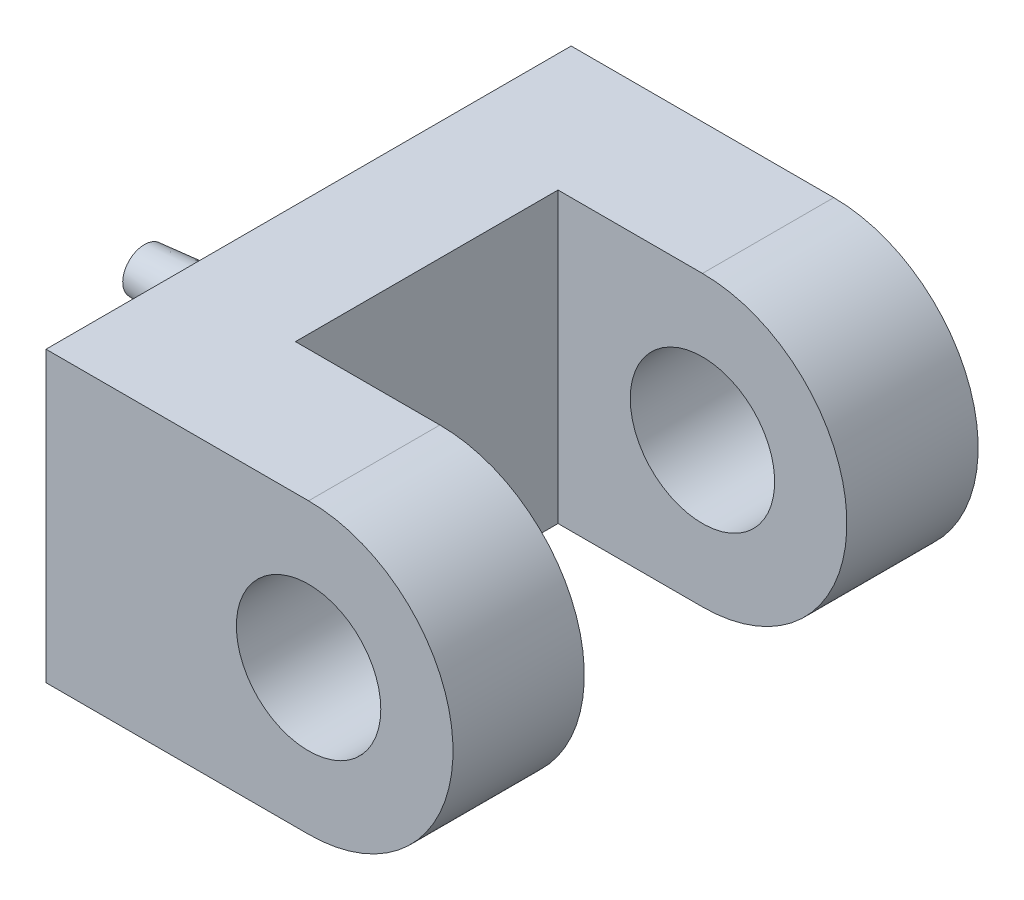
ISO-10303-21;
HEADER;
FILE_DESCRIPTION(('STEP AP214'),'2;1');
FILE_NAME('part.step','',(''),(''),'','','');
FILE_SCHEMA(('AUTOMOTIVE_DESIGN { 1 0 10303 214 1 1 1 1 }'));
ENDSEC;
DATA;
#1=APPLICATION_CONTEXT('core data for automotive mechanical design processes');
#2=APPLICATION_PROTOCOL_DEFINITION('international standard','automotive_design',2000,#1);
#3=PRODUCT_CONTEXT('',#1,'mechanical');
#4=PRODUCT('Part','Part','',(#3));
#5=PRODUCT_RELATED_PRODUCT_CATEGORY('part','',(#4));
#6=PRODUCT_DEFINITION_FORMATION('','',#4);
#7=PRODUCT_DEFINITION_CONTEXT('part definition',#1,'design');
#8=PRODUCT_DEFINITION('design','',#6,#7);
#9=PRODUCT_DEFINITION_SHAPE('','',#8);
#10=(LENGTH_UNIT() NAMED_UNIT(*) SI_UNIT(.MILLI.,.METRE.));
#11=(NAMED_UNIT(*) PLANE_ANGLE_UNIT() SI_UNIT($,.RADIAN.));
#12=(NAMED_UNIT(*) SI_UNIT($,.STERADIAN.) SOLID_ANGLE_UNIT());
#13=UNCERTAINTY_MEASURE_WITH_UNIT(LENGTH_MEASURE(1.E-05),#10,'distance_accuracy_value','');
#14=(GEOMETRIC_REPRESENTATION_CONTEXT(3) GLOBAL_UNCERTAINTY_ASSIGNED_CONTEXT((#13)) GLOBAL_UNIT_ASSIGNED_CONTEXT((#10,
#11,#12)) REPRESENTATION_CONTEXT('',''));
#15=CARTESIAN_POINT('',(0.,0.,0.));
#16=DIRECTION('',(0.,0.,1.));
#17=DIRECTION('',(1.,0.,0.));
#18=AXIS2_PLACEMENT_3D('',#15,#16,#17);
#19=CARTESIAN_POINT('',(0.,0.,40.));
#20=DIRECTION('',(0.,0.,-1.));
#21=DIRECTION('',(-1.,0.,0.));
#22=AXIS2_PLACEMENT_3D('',#19,#20,#21);
#23=CYLINDRICAL_SURFACE('',#22,22.);
#24=CARTESIAN_POINT('',(0.,0.,20.));
#25=DIRECTION('',(0.,0.,1.));
#26=DIRECTION('',(1.,0.,0.));
#27=AXIS2_PLACEMENT_3D('',#24,#25,#26);
#28=CIRCLE('',#27,22.);
#29=CARTESIAN_POINT('',(0.,-22.,20.));
#30=VERTEX_POINT('',#29);
#31=CARTESIAN_POINT('',(0.,22.,20.));
#32=VERTEX_POINT('',#31);
#33=EDGE_CURVE('E141',#30,#32,#28,.T.);
#34=ORIENTED_EDGE('',*,*,#33,.T.);
#35=DIRECTION('',(0.,0.,-1.));
#36=VECTOR('',#35,1.);
#37=CARTESIAN_POINT('',(0.,22.,40.));
#38=LINE('',#37,#36);
#39=CARTESIAN_POINT('',(0.,22.,40.));
#40=VERTEX_POINT('',#39);
#41=EDGE_CURVE('E41',#40,#32,#38,.T.);
#42=ORIENTED_EDGE('',*,*,#41,.F.);
#43=CARTESIAN_POINT('',(0.,0.,40.));
#44=DIRECTION('',(0.,0.,1.));
#45=DIRECTION('',(-1.,0.,0.));
#46=AXIS2_PLACEMENT_3D('',#43,#44,#45);
#47=CIRCLE('',#46,22.);
#48=CARTESIAN_POINT('',(0.,-22.,40.));
#49=VERTEX_POINT('',#48);
#50=EDGE_CURVE('E150',#49,#40,#47,.T.);
#51=ORIENTED_EDGE('',*,*,#50,.F.);
#52=DIRECTION('',(0.,0.,-1.));
#53=VECTOR('',#52,1.);
#54=CARTESIAN_POINT('',(0.,-22.,40.));
#55=LINE('',#54,#53);
#56=EDGE_CURVE('E163',#49,#30,#55,.T.);
#57=ORIENTED_EDGE('',*,*,#56,.T.);
#58=EDGE_LOOP('',(#34,#42,#51,#57));
#59=FACE_BOUND('',#58,.T.);
#60=ADVANCED_FACE('F33',(#59),#23,.T.);
#61=CARTESIAN_POINT('',(0.,0.,40.));
#62=DIRECTION('',(0.,0.,-1.));
#63=DIRECTION('',(-1.,0.,0.));
#64=AXIS2_PLACEMENT_3D('',#61,#62,#63);
#65=CYLINDRICAL_SURFACE('',#64,11.);
#66=CARTESIAN_POINT('',(0.,0.,20.));
#67=DIRECTION('',(0.,0.,1.));
#68=DIRECTION('',(1.,0.,0.));
#69=AXIS2_PLACEMENT_3D('',#66,#67,#68);
#70=CIRCLE('',#69,11.);
#71=CARTESIAN_POINT('',(11.,0.,20.));
#72=VERTEX_POINT('',#71);
#73=EDGE_CURVE('E140',#72,#72,#70,.T.);
#74=ORIENTED_EDGE('',*,*,#73,.F.);
#75=EDGE_LOOP('',(#74));
#76=FACE_BOUND('',#75,.T.);
#77=CARTESIAN_POINT('',(0.,0.,40.));
#78=DIRECTION('',(0.,0.,1.));
#79=DIRECTION('',(1.,0.,0.));
#80=AXIS2_PLACEMENT_3D('',#77,#78,#79);
#81=CIRCLE('',#80,11.);
#82=CARTESIAN_POINT('',(11.,0.,40.));
#83=VERTEX_POINT('',#82);
#84=EDGE_CURVE('E144',#83,#83,#81,.T.);
#85=ORIENTED_EDGE('',*,*,#84,.T.);
#86=EDGE_LOOP('',(#85));
#87=FACE_BOUND('',#86,.T.);
#88=ADVANCED_FACE('F181',(#76,#87),#65,.F.);
#89=CARTESIAN_POINT('',(0.,0.,40.));
#90=DIRECTION('',(0.,0.,-1.));
#91=DIRECTION('',(-1.,0.,0.));
#92=AXIS2_PLACEMENT_3D('',#89,#90,#91);
#93=PLANE('',#92);
#94=ORIENTED_EDGE('',*,*,#50,.T.);
#95=DIRECTION('',(-1.,0.,0.));
#96=VECTOR('',#95,1.);
#97=CARTESIAN_POINT('',(0.,22.,40.));
#98=LINE('',#97,#96);
#99=CARTESIAN_POINT('',(-40.,22.,40.));
#100=VERTEX_POINT('',#99);
#101=EDGE_CURVE('E87',#40,#100,#98,.T.);
#102=ORIENTED_EDGE('',*,*,#101,.T.);
#103=DIRECTION('',(0.,-1.,0.));
#104=VECTOR('',#103,1.);
#105=CARTESIAN_POINT('',(-40.,22.,40.));
#106=LINE('',#105,#104);
#107=CARTESIAN_POINT('',(-40.,-22.,40.));
#108=VERTEX_POINT('',#107);
#109=EDGE_CURVE('E154',#100,#108,#106,.T.);
#110=ORIENTED_EDGE('',*,*,#109,.T.);
#111=DIRECTION('',(1.,0.,0.));
#112=VECTOR('',#111,1.);
#113=CARTESIAN_POINT('',(-40.,-22.,40.));
#114=LINE('',#113,#112);
#115=EDGE_CURVE('E57',#108,#49,#114,.T.);
#116=ORIENTED_EDGE('',*,*,#115,.T.);
#117=EDGE_LOOP('',(#94,#102,#110,#116));
#118=FACE_BOUND('',#117,.T.);
#119=ORIENTED_EDGE('',*,*,#84,.F.);
#120=EDGE_LOOP('',(#119));
#121=FACE_BOUND('',#120,.T.);
#122=ADVANCED_FACE('F184',(#118,#121),#93,.F.);
#123=CARTESIAN_POINT('',(0.,0.,-40.));
#124=DIRECTION('',(0.,0.,-1.));
#125=DIRECTION('',(-1.,0.,0.));
#126=AXIS2_PLACEMENT_3D('',#123,#124,#125);
#127=PLANE('',#126);
#128=CARTESIAN_POINT('',(0.,0.,-40.));
#129=DIRECTION('',(0.,0.,1.));
#130=DIRECTION('',(-1.,0.,0.));
#131=AXIS2_PLACEMENT_3D('',#128,#129,#130);
#132=CIRCLE('',#131,22.);
#133=CARTESIAN_POINT('',(0.,-22.,-40.));
#134=VERTEX_POINT('',#133);
#135=CARTESIAN_POINT('',(0.,22.,-40.));
#136=VERTEX_POINT('',#135);
#137=EDGE_CURVE('E147',#134,#136,#132,.T.);
#138=ORIENTED_EDGE('',*,*,#137,.F.);
#139=DIRECTION('',(1.,0.,0.));
#140=VECTOR('',#139,1.);
#141=CARTESIAN_POINT('',(-40.,-22.,-40.));
#142=LINE('',#141,#140);
#143=CARTESIAN_POINT('',(-40.,-22.,-40.));
#144=VERTEX_POINT('',#143);
#145=EDGE_CURVE('E152',#144,#134,#142,.T.);
#146=ORIENTED_EDGE('',*,*,#145,.F.);
#147=DIRECTION('',(0.,-1.,0.));
#148=VECTOR('',#147,1.);
#149=CARTESIAN_POINT('',(-40.,22.,-40.));
#150=LINE('',#149,#148);
#151=CARTESIAN_POINT('',(-40.,22.,-40.));
#152=VERTEX_POINT('',#151);
#153=EDGE_CURVE('E160',#152,#144,#150,.T.);
#154=ORIENTED_EDGE('',*,*,#153,.F.);
#155=DIRECTION('',(-1.,0.,0.));
#156=VECTOR('',#155,1.);
#157=CARTESIAN_POINT('',(0.,22.,-40.));
#158=LINE('',#157,#156);
#159=EDGE_CURVE('E158',#136,#152,#158,.T.);
#160=ORIENTED_EDGE('',*,*,#159,.F.);
#161=EDGE_LOOP('',(#138,#146,#154,#160));
#162=FACE_BOUND('',#161,.T.);
#163=CARTESIAN_POINT('',(0.,0.,-40.));
#164=DIRECTION('',(0.,0.,1.));
#165=DIRECTION('',(1.,0.,0.));
#166=AXIS2_PLACEMENT_3D('',#163,#164,#165);
#167=CIRCLE('',#166,11.);
#168=CARTESIAN_POINT('',(11.,0.,-40.));
#169=VERTEX_POINT('',#168);
#170=EDGE_CURVE('E143',#169,#169,#167,.T.);
#171=ORIENTED_EDGE('',*,*,#170,.T.);
#172=EDGE_LOOP('',(#171));
#173=FACE_BOUND('',#172,.T.);
#174=ADVANCED_FACE('F190',(#162,#173),#127,.T.);
#175=CARTESIAN_POINT('',(0.,22.,-20.));
#176=VERTEX_POINT('',#175);
#177=EDGE_CURVE('E172',#176,#136,#38,.T.);
#178=ORIENTED_EDGE('',*,*,#177,.F.);
#179=CARTESIAN_POINT('',(0.,0.,-20.));
#180=DIRECTION('',(0.,0.,-1.));
#181=DIRECTION('',(-1.,0.,0.));
#182=AXIS2_PLACEMENT_3D('',#179,#180,#181);
#183=CIRCLE('',#182,22.);
#184=CARTESIAN_POINT('',(0.,-22.,-20.));
#185=VERTEX_POINT('',#184);
#186=EDGE_CURVE('E113',#176,#185,#183,.T.);
#187=ORIENTED_EDGE('',*,*,#186,.T.);
#188=EDGE_CURVE('E79',#185,#134,#55,.T.);
#189=ORIENTED_EDGE('',*,*,#188,.T.);
#190=ORIENTED_EDGE('',*,*,#137,.T.);
#191=EDGE_LOOP('',(#178,#187,#189,#190));
#192=FACE_BOUND('',#191,.T.);
#193=ADVANCED_FACE('F35',(#192),#23,.T.);
#194=CARTESIAN_POINT('',(0.,22.,40.));
#195=DIRECTION('',(0.,-1.,0.));
#196=DIRECTION('',(1.,0.,0.));
#197=AXIS2_PLACEMENT_3D('',#194,#195,#196);
#198=PLANE('',#197);
#199=ORIENTED_EDGE('',*,*,#41,.T.);
#200=DIRECTION('',(1.,0.,0.));
#201=VECTOR('',#200,1.);
#202=CARTESIAN_POINT('',(-22.,22.,20.));
#203=LINE('',#202,#201);
#204=CARTESIAN_POINT('',(-22.,22.,20.));
#205=VERTEX_POINT('',#204);
#206=EDGE_CURVE('E127',#205,#32,#203,.T.);
#207=ORIENTED_EDGE('',*,*,#206,.F.);
#208=DIRECTION('',(0.,0.,1.));
#209=VECTOR('',#208,1.);
#210=CARTESIAN_POINT('',(-22.,22.,20.));
#211=LINE('',#210,#209);
#212=CARTESIAN_POINT('',(-22.,22.,-20.));
#213=VERTEX_POINT('',#212);
#214=EDGE_CURVE('E116',#213,#205,#211,.T.);
#215=ORIENTED_EDGE('',*,*,#214,.F.);
#216=DIRECTION('',(-1.,0.,0.));
#217=VECTOR('',#216,1.);
#218=CARTESIAN_POINT('',(-22.,22.,-20.));
#219=LINE('',#218,#217);
#220=EDGE_CURVE('E108',#176,#213,#219,.T.);
#221=ORIENTED_EDGE('',*,*,#220,.F.);
#222=ORIENTED_EDGE('',*,*,#177,.T.);
#223=ORIENTED_EDGE('',*,*,#159,.T.);
#224=DIRECTION('',(0.,0.,-1.));
#225=VECTOR('',#224,1.);
#226=CARTESIAN_POINT('',(-40.,22.,40.));
#227=LINE('',#226,#225);
#228=EDGE_CURVE('E169',#100,#152,#227,.T.);
#229=ORIENTED_EDGE('',*,*,#228,.F.);
#230=ORIENTED_EDGE('',*,*,#101,.F.);
#231=EDGE_LOOP('',(#199,#207,#215,#221,#222,#223,#229,#230));
#232=FACE_BOUND('',#231,.T.);
#233=ADVANCED_FACE('F125',(#232),#198,.F.);
#234=CARTESIAN_POINT('',(-40.,22.,40.));
#235=DIRECTION('',(1.,0.,0.));
#236=DIRECTION('',(0.,1.,0.));
#237=AXIS2_PLACEMENT_3D('',#234,#235,#236);
#238=PLANE('',#237);
#239=CARTESIAN_POINT('',(-40.,0.,0.));
#240=DIRECTION('',(1.,0.,0.));
#241=DIRECTION('',(0.,1.,0.));
#242=AXIS2_PLACEMENT_3D('',#239,#240,#241);
#243=CIRCLE('',#242,5.5);
#244=CARTESIAN_POINT('',(-40.,5.49999999999999,0.));
#245=VERTEX_POINT('',#244);
#246=EDGE_CURVE('E11',#245,#245,#243,.F.);
#247=ORIENTED_EDGE('',*,*,#246,.F.);
#248=EDGE_LOOP('',(#247));
#249=FACE_BOUND('',#248,.T.);
#250=ORIENTED_EDGE('',*,*,#153,.T.);
#251=DIRECTION('',(0.,0.,-1.));
#252=VECTOR('',#251,1.);
#253=CARTESIAN_POINT('',(-40.,-22.,40.));
#254=LINE('',#253,#252);
#255=EDGE_CURVE('E166',#108,#144,#254,.T.);
#256=ORIENTED_EDGE('',*,*,#255,.F.);
#257=ORIENTED_EDGE('',*,*,#109,.F.);
#258=ORIENTED_EDGE('',*,*,#228,.T.);
#259=EDGE_LOOP('',(#250,#256,#257,#258));
#260=FACE_BOUND('',#259,.T.);
#261=ADVANCED_FACE('F205',(#249,#260),#238,.F.);
#262=CARTESIAN_POINT('',(-40.,-22.,40.));
#263=DIRECTION('',(0.,1.,0.));
#264=DIRECTION('',(0.,0.,1.));
#265=AXIS2_PLACEMENT_3D('',#262,#263,#264);
#266=PLANE('',#265);
#267=DIRECTION('',(0.,0.,1.));
#268=VECTOR('',#267,1.);
#269=CARTESIAN_POINT('',(-22.,-22.,20.));
#270=LINE('',#269,#268);
#271=CARTESIAN_POINT('',(-22.,-22.,-20.));
#272=VERTEX_POINT('',#271);
#273=CARTESIAN_POINT('',(-22.,-22.,20.));
#274=VERTEX_POINT('',#273);
#275=EDGE_CURVE('E48',#272,#274,#270,.T.);
#276=ORIENTED_EDGE('',*,*,#275,.T.);
#277=DIRECTION('',(1.,0.,0.));
#278=VECTOR('',#277,1.);
#279=CARTESIAN_POINT('',(-22.,-22.,20.));
#280=LINE('',#279,#278);
#281=EDGE_CURVE('E123',#274,#30,#280,.T.);
#282=ORIENTED_EDGE('',*,*,#281,.T.);
#283=ORIENTED_EDGE('',*,*,#56,.F.);
#284=ORIENTED_EDGE('',*,*,#115,.F.);
#285=ORIENTED_EDGE('',*,*,#255,.T.);
#286=ORIENTED_EDGE('',*,*,#145,.T.);
#287=ORIENTED_EDGE('',*,*,#188,.F.);
#288=DIRECTION('',(-1.,0.,0.));
#289=VECTOR('',#288,1.);
#290=CARTESIAN_POINT('',(-22.,-22.,-20.));
#291=LINE('',#290,#289);
#292=EDGE_CURVE('E129',#185,#272,#291,.T.);
#293=ORIENTED_EDGE('',*,*,#292,.T.);
#294=EDGE_LOOP('',(#276,#282,#283,#284,#285,#286,#287,#293));
#295=FACE_BOUND('',#294,.T.);
#296=ADVANCED_FACE('F215',(#295),#266,.F.);
#297=CARTESIAN_POINT('',(0.,0.,-20.));
#298=DIRECTION('',(0.,0.,-1.));
#299=DIRECTION('',(-1.,0.,0.));
#300=AXIS2_PLACEMENT_3D('',#297,#298,#299);
#301=CIRCLE('',#300,11.);
#302=CARTESIAN_POINT('',(-11.,0.,-20.));
#303=VERTEX_POINT('',#302);
#304=EDGE_CURVE('E137',#303,#303,#301,.T.);
#305=ORIENTED_EDGE('',*,*,#304,.F.);
#306=EDGE_LOOP('',(#305));
#307=FACE_BOUND('',#306,.T.);
#308=ORIENTED_EDGE('',*,*,#170,.F.);
#309=EDGE_LOOP('',(#308));
#310=FACE_BOUND('',#309,.T.);
#311=ADVANCED_FACE('F186',(#307,#310),#65,.F.);
#312=CARTESIAN_POINT('',(-22.,-22.,20.));
#313=DIRECTION('',(0.,0.,1.));
#314=DIRECTION('',(1.,0.,0.));
#315=AXIS2_PLACEMENT_3D('',#312,#313,#314);
#316=PLANE('',#315);
#317=ORIENTED_EDGE('',*,*,#73,.T.);
#318=EDGE_LOOP('',(#317));
#319=FACE_BOUND('',#318,.T.);
#320=ORIENTED_EDGE('',*,*,#33,.F.);
#321=ORIENTED_EDGE('',*,*,#281,.F.);
#322=DIRECTION('',(0.,1.,0.));
#323=VECTOR('',#322,1.);
#324=CARTESIAN_POINT('',(-22.,-22.,20.));
#325=LINE('',#324,#323);
#326=EDGE_CURVE('E122',#274,#205,#325,.T.);
#327=ORIENTED_EDGE('',*,*,#326,.T.);
#328=ORIENTED_EDGE('',*,*,#206,.T.);
#329=EDGE_LOOP('',(#320,#321,#327,#328));
#330=FACE_BOUND('',#329,.T.);
#331=ADVANCED_FACE('F178',(#319,#330),#316,.F.);
#332=CARTESIAN_POINT('',(-22.,-22.,-20.));
#333=DIRECTION('',(0.,0.,-1.));
#334=DIRECTION('',(-1.,0.,0.));
#335=AXIS2_PLACEMENT_3D('',#332,#333,#334);
#336=PLANE('',#335);
#337=ORIENTED_EDGE('',*,*,#304,.T.);
#338=EDGE_LOOP('',(#337));
#339=FACE_BOUND('',#338,.T.);
#340=ORIENTED_EDGE('',*,*,#220,.T.);
#341=DIRECTION('',(0.,1.,0.));
#342=VECTOR('',#341,1.);
#343=CARTESIAN_POINT('',(-22.,-22.,-20.));
#344=LINE('',#343,#342);
#345=EDGE_CURVE('E111',#272,#213,#344,.T.);
#346=ORIENTED_EDGE('',*,*,#345,.F.);
#347=ORIENTED_EDGE('',*,*,#292,.F.);
#348=ORIENTED_EDGE('',*,*,#186,.F.);
#349=EDGE_LOOP('',(#340,#346,#347,#348));
#350=FACE_BOUND('',#349,.T.);
#351=ADVANCED_FACE('F109',(#339,#350),#336,.F.);
#352=CARTESIAN_POINT('',(-22.,-22.,20.));
#353=DIRECTION('',(-1.,0.,0.));
#354=DIRECTION('',(0.,0.,1.));
#355=AXIS2_PLACEMENT_3D('',#352,#353,#354);
#356=PLANE('',#355);
#357=ORIENTED_EDGE('',*,*,#326,.F.);
#358=ORIENTED_EDGE('',*,*,#275,.F.);
#359=ORIENTED_EDGE('',*,*,#345,.T.);
#360=ORIENTED_EDGE('',*,*,#214,.T.);
#361=EDGE_LOOP('',(#357,#358,#359,#360));
#362=FACE_BOUND('',#361,.T.);
#363=ADVANCED_FACE('F120',(#362),#356,.F.);
#364=CARTESIAN_POINT('',(-40.,0.,0.));
#365=DIRECTION('',(1.,0.,0.));
#366=DIRECTION('',(0.,-1.,0.));
#367=AXIS2_PLACEMENT_3D('',#364,#365,#366);
#368=CONICAL_SURFACE('',#367,5.5,0.0872664625997165);
#369=CARTESIAN_POINT('',(-65.,0.,0.));
#370=DIRECTION('',(-1.,0.,0.));
#371=DIRECTION('',(0.,-1.,0.));
#372=AXIS2_PLACEMENT_3D('',#369,#370,#371);
#373=CIRCLE('',#372,3.3127834118519);
#374=CARTESIAN_POINT('',(-65.,-3.31278341185191,0.));
#375=VERTEX_POINT('',#374);
#376=EDGE_CURVE('E117',#375,#375,#373,.T.);
#377=ORIENTED_EDGE('',*,*,#376,.F.);
#378=EDGE_LOOP('',(#377));
#379=FACE_BOUND('',#378,.T.);
#380=ORIENTED_EDGE('',*,*,#246,.T.);
#381=EDGE_LOOP('',(#380));
#382=FACE_BOUND('',#381,.T.);
#383=ADVANCED_FACE('F230',(#379,#382),#368,.T.);
#384=CARTESIAN_POINT('',(-65.,0.,0.));
#385=DIRECTION('',(-1.,0.,0.));
#386=DIRECTION('',(0.,-1.,0.));
#387=AXIS2_PLACEMENT_3D('',#384,#385,#386);
#388=PLANE('',#387);
#389=ORIENTED_EDGE('',*,*,#376,.T.);
#390=EDGE_LOOP('',(#389));
#391=FACE_BOUND('',#390,.T.);
#392=ADVANCED_FACE('F236',(#391),#388,.T.);
#393=CLOSED_SHELL('',(#60,#88,#122,#174,#193,#233,#261,#296,#311,#331,#351,#363,#383,#392));
#394=MANIFOLD_SOLID_BREP('B2',#393);
#395=ADVANCED_BREP_SHAPE_REPRESENTATION('',(#18,#394),#14);
#396=SHAPE_DEFINITION_REPRESENTATION(#9,#395);
ENDSEC;
END-ISO-10303-21;
